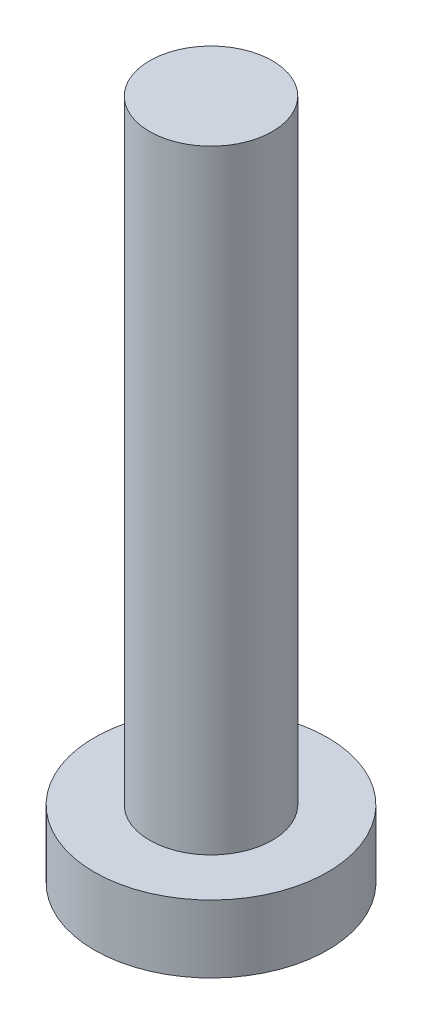
ISO-10303-21;
HEADER;
FILE_DESCRIPTION(('STEP AP214'),'2;1');
FILE_NAME('part.step','',(''),(''),'','','');
FILE_SCHEMA(('AUTOMOTIVE_DESIGN { 1 0 10303 214 1 1 1 1 }'));
ENDSEC;
DATA;
#1=APPLICATION_CONTEXT('core data for automotive mechanical design processes');
#2=APPLICATION_PROTOCOL_DEFINITION('international standard','automotive_design',2000,#1);
#3=PRODUCT_CONTEXT('',#1,'mechanical');
#4=PRODUCT('Part','Part','',(#3));
#5=PRODUCT_RELATED_PRODUCT_CATEGORY('part','',(#4));
#6=PRODUCT_DEFINITION_FORMATION('','',#4);
#7=PRODUCT_DEFINITION_CONTEXT('part definition',#1,'design');
#8=PRODUCT_DEFINITION('design','',#6,#7);
#9=PRODUCT_DEFINITION_SHAPE('','',#8);
#10=(LENGTH_UNIT() NAMED_UNIT(*) SI_UNIT(.MILLI.,.METRE.));
#11=(NAMED_UNIT(*) PLANE_ANGLE_UNIT() SI_UNIT($,.RADIAN.));
#12=(NAMED_UNIT(*) SI_UNIT($,.STERADIAN.) SOLID_ANGLE_UNIT());
#13=UNCERTAINTY_MEASURE_WITH_UNIT(LENGTH_MEASURE(1.E-05),#10,'distance_accuracy_value','');
#14=(GEOMETRIC_REPRESENTATION_CONTEXT(3) GLOBAL_UNCERTAINTY_ASSIGNED_CONTEXT((#13)) GLOBAL_UNIT_ASSIGNED_CONTEXT((#10,
#11,#12)) REPRESENTATION_CONTEXT('',''));
#15=CARTESIAN_POINT('',(0.,0.,0.));
#16=DIRECTION('',(0.,0.,1.));
#17=DIRECTION('',(1.,0.,0.));
#18=AXIS2_PLACEMENT_3D('',#15,#16,#17);
#19=CARTESIAN_POINT('',(0.,2.2,0.));
#20=DIRECTION('',(0.,-1.,0.));
#21=DIRECTION('',(0.,0.,-1.));
#22=AXIS2_PLACEMENT_3D('',#19,#20,#21);
#23=CYLINDRICAL_SURFACE('',#22,3.8);
#24=CARTESIAN_POINT('',(0.,2.2,0.));
#25=DIRECTION('',(0.,1.,0.));
#26=DIRECTION('',(0.,0.,1.));
#27=AXIS2_PLACEMENT_3D('',#24,#25,#26);
#28=CIRCLE('',#27,3.8);
#29=CARTESIAN_POINT('',(0.,2.2,3.8));
#30=VERTEX_POINT('',#29);
#31=EDGE_CURVE('E10',#30,#30,#28,.T.);
#32=ORIENTED_EDGE('',*,*,#31,.F.);
#33=EDGE_LOOP('',(#32));
#34=FACE_BOUND('',#33,.T.);
#35=CARTESIAN_POINT('',(0.,0.,0.));
#36=DIRECTION('',(0.,1.,0.));
#37=DIRECTION('',(0.,0.,1.));
#38=AXIS2_PLACEMENT_3D('',#35,#36,#37);
#39=CIRCLE('',#38,3.8);
#40=CARTESIAN_POINT('',(0.,0.,3.8));
#41=VERTEX_POINT('',#40);
#42=EDGE_CURVE('E36',#41,#41,#39,.T.);
#43=ORIENTED_EDGE('',*,*,#42,.T.);
#44=EDGE_LOOP('',(#43));
#45=FACE_BOUND('',#44,.T.);
#46=ADVANCED_FACE('F33',(#34,#45),#23,.T.);
#47=CARTESIAN_POINT('',(0.,2.2,0.));
#48=DIRECTION('',(0.,1.,0.));
#49=DIRECTION('',(0.,0.,1.));
#50=AXIS2_PLACEMENT_3D('',#47,#48,#49);
#51=PLANE('',#50);
#52=CARTESIAN_POINT('',(0.,2.2,0.));
#53=DIRECTION('',(0.,1.,0.));
#54=DIRECTION('',(0.,0.,1.));
#55=AXIS2_PLACEMENT_3D('',#52,#53,#54);
#56=CIRCLE('',#55,2.);
#57=CARTESIAN_POINT('',(0.,2.2,2.));
#58=VERTEX_POINT('',#57);
#59=EDGE_CURVE('E45',#58,#58,#56,.T.);
#60=ORIENTED_EDGE('',*,*,#59,.F.);
#61=EDGE_LOOP('',(#60));
#62=FACE_BOUND('',#61,.T.);
#63=ORIENTED_EDGE('',*,*,#31,.T.);
#64=EDGE_LOOP('',(#63));
#65=FACE_BOUND('',#64,.T.);
#66=ADVANCED_FACE('F60',(#62,#65),#51,.T.);
#67=CARTESIAN_POINT('',(0.,0.,0.));
#68=DIRECTION('',(0.,1.,0.));
#69=DIRECTION('',(0.,0.,1.));
#70=AXIS2_PLACEMENT_3D('',#67,#68,#69);
#71=PLANE('',#70);
#72=ORIENTED_EDGE('',*,*,#42,.F.);
#73=EDGE_LOOP('',(#72));
#74=FACE_BOUND('',#73,.T.);
#75=ADVANCED_FACE('F56',(#74),#71,.F.);
#76=CARTESIAN_POINT('',(0.,22.2,0.));
#77=DIRECTION('',(0.,-1.,0.));
#78=DIRECTION('',(0.,0.,-1.));
#79=AXIS2_PLACEMENT_3D('',#76,#77,#78);
#80=CYLINDRICAL_SURFACE('',#79,2.);
#81=CARTESIAN_POINT('',(0.,22.2,0.));
#82=DIRECTION('',(0.,1.,0.));
#83=DIRECTION('',(0.,0.,1.));
#84=AXIS2_PLACEMENT_3D('',#81,#82,#83);
#85=CIRCLE('',#84,2.);
#86=CARTESIAN_POINT('',(0.,22.2,2.));
#87=VERTEX_POINT('',#86);
#88=EDGE_CURVE('E43',#87,#87,#85,.T.);
#89=ORIENTED_EDGE('',*,*,#88,.F.);
#90=EDGE_LOOP('',(#89));
#91=FACE_BOUND('',#90,.T.);
#92=ORIENTED_EDGE('',*,*,#59,.T.);
#93=EDGE_LOOP('',(#92));
#94=FACE_BOUND('',#93,.T.);
#95=ADVANCED_FACE('F53',(#91,#94),#80,.T.);
#96=CARTESIAN_POINT('',(0.,22.2,0.));
#97=DIRECTION('',(0.,1.,0.));
#98=DIRECTION('',(0.,0.,1.));
#99=AXIS2_PLACEMENT_3D('',#96,#97,#98);
#100=PLANE('',#99);
#101=ORIENTED_EDGE('',*,*,#88,.T.);
#102=EDGE_LOOP('',(#101));
#103=FACE_BOUND('',#102,.T.);
#104=ADVANCED_FACE('F51',(#103),#100,.T.);
#105=CLOSED_SHELL('',(#46,#66,#75,#95,#104));
#106=MANIFOLD_SOLID_BREP('B2',#105);
#107=ADVANCED_BREP_SHAPE_REPRESENTATION('',(#18,#106),#14);
#108=SHAPE_DEFINITION_REPRESENTATION(#9,#107);
ENDSEC;
END-ISO-10303-21;
